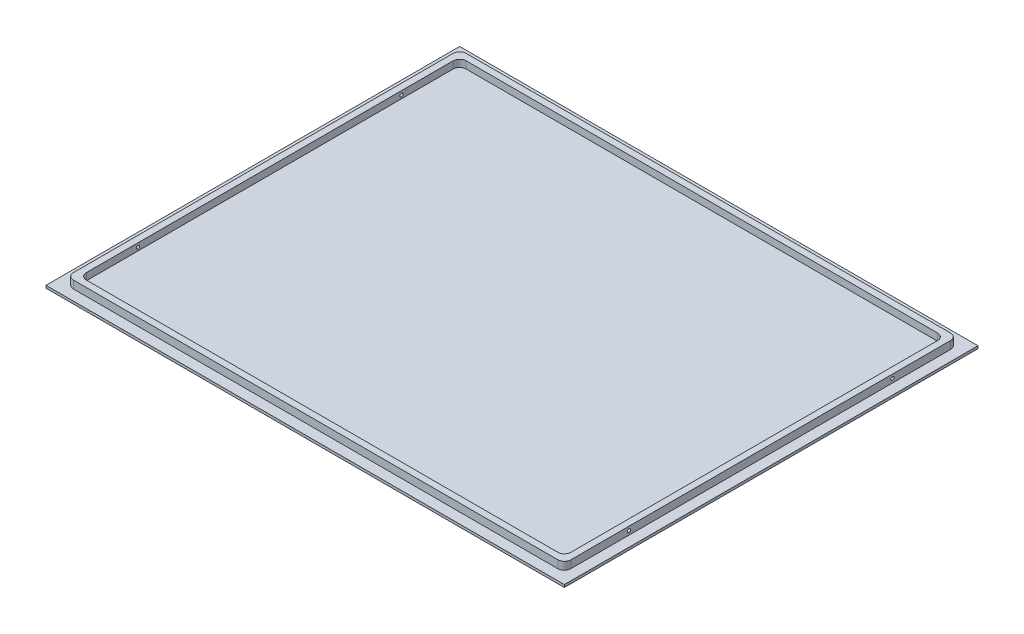
ISO-10303-21;
HEADER;
FILE_DESCRIPTION(('STEP AP214'),'2;1');
FILE_NAME('part.step','',(''),(''),'','','');
FILE_SCHEMA(('AUTOMOTIVE_DESIGN { 1 0 10303 214 1 1 1 1 }'));
ENDSEC;
DATA;
#1=APPLICATION_CONTEXT('core data for automotive mechanical design processes');
#2=APPLICATION_PROTOCOL_DEFINITION('international standard','automotive_design',2000,#1);
#3=PRODUCT_CONTEXT('',#1,'mechanical');
#4=PRODUCT('Part','Part','',(#3));
#5=PRODUCT_RELATED_PRODUCT_CATEGORY('part','',(#4));
#6=PRODUCT_DEFINITION_FORMATION('','',#4);
#7=PRODUCT_DEFINITION_CONTEXT('part definition',#1,'design');
#8=PRODUCT_DEFINITION('design','',#6,#7);
#9=PRODUCT_DEFINITION_SHAPE('','',#8);
#10=(LENGTH_UNIT() NAMED_UNIT(*) SI_UNIT(.MILLI.,.METRE.));
#11=(NAMED_UNIT(*) PLANE_ANGLE_UNIT() SI_UNIT($,.RADIAN.));
#12=(NAMED_UNIT(*) SI_UNIT($,.STERADIAN.) SOLID_ANGLE_UNIT());
#13=UNCERTAINTY_MEASURE_WITH_UNIT(LENGTH_MEASURE(1.E-05),#10,'distance_accuracy_value','');
#14=(GEOMETRIC_REPRESENTATION_CONTEXT(3) GLOBAL_UNCERTAINTY_ASSIGNED_CONTEXT((#13)) GLOBAL_UNIT_ASSIGNED_CONTEXT((#10,
#11,#12)) REPRESENTATION_CONTEXT('',''));
#15=CARTESIAN_POINT('',(0.,0.,0.));
#16=DIRECTION('',(0.,0.,1.));
#17=DIRECTION('',(1.,0.,0.));
#18=AXIS2_PLACEMENT_3D('',#15,#16,#17);
#19=CARTESIAN_POINT('',(-200.5,8.,-160.));
#20=DIRECTION('',(1.,0.,0.));
#21=DIRECTION('',(0.,0.,-1.));
#22=AXIS2_PLACEMENT_3D('',#19,#20,#21);
#23=PLANE('',#22);
#24=DIRECTION('',(0.,0.,1.));
#25=VECTOR('',#24,1.);
#26=CARTESIAN_POINT('',(-200.5,2.,-160.));
#27=LINE('',#26,#25);
#28=CARTESIAN_POINT('',(-200.5,2.,-160.));
#29=VERTEX_POINT('',#28);
#30=CARTESIAN_POINT('',(-200.5,2.,160.));
#31=VERTEX_POINT('',#30);
#32=EDGE_CURVE('E175',#29,#31,#27,.T.);
#33=ORIENTED_EDGE('',*,*,#32,.F.);
#34=DIRECTION('',(0.,-1.,0.));
#35=VECTOR('',#34,1.);
#36=CARTESIAN_POINT('',(-200.5,8.,-160.));
#37=LINE('',#36,#35);
#38=CARTESIAN_POINT('',(-200.5,0.,-160.));
#39=VERTEX_POINT('',#38);
#40=EDGE_CURVE('E187',#29,#39,#37,.T.);
#41=ORIENTED_EDGE('',*,*,#40,.T.);
#42=DIRECTION('',(0.,0.,1.));
#43=VECTOR('',#42,1.);
#44=CARTESIAN_POINT('',(-200.5,0.,-160.));
#45=LINE('',#44,#43);
#46=CARTESIAN_POINT('',(-200.5,0.,160.));
#47=VERTEX_POINT('',#46);
#48=EDGE_CURVE('E339',#39,#47,#45,.T.);
#49=ORIENTED_EDGE('',*,*,#48,.T.);
#50=DIRECTION('',(0.,-1.,0.));
#51=VECTOR('',#50,1.);
#52=CARTESIAN_POINT('',(-200.5,8.,160.));
#53=LINE('',#52,#51);
#54=EDGE_CURVE('E189',#31,#47,#53,.T.);
#55=ORIENTED_EDGE('',*,*,#54,.F.);
#56=EDGE_LOOP('',(#33,#41,#49,#55));
#57=FACE_BOUND('',#56,.T.);
#58=ADVANCED_FACE('F33',(#57),#23,.F.);
#59=CARTESIAN_POINT('',(-200.5,8.,160.));
#60=DIRECTION('',(0.,0.,-1.));
#61=DIRECTION('',(-1.,0.,0.));
#62=AXIS2_PLACEMENT_3D('',#59,#60,#61);
#63=PLANE('',#62);
#64=DIRECTION('',(1.,0.,0.));
#65=VECTOR('',#64,1.);
#66=CARTESIAN_POINT('',(-200.5,2.,160.));
#67=LINE('',#66,#65);
#68=CARTESIAN_POINT('',(200.5,2.,160.));
#69=VERTEX_POINT('',#68);
#70=EDGE_CURVE('E190',#31,#69,#67,.T.);
#71=ORIENTED_EDGE('',*,*,#70,.F.);
#72=ORIENTED_EDGE('',*,*,#54,.T.);
#73=DIRECTION('',(1.,0.,0.));
#74=VECTOR('',#73,1.);
#75=CARTESIAN_POINT('',(-200.5,0.,160.));
#76=LINE('',#75,#74);
#77=CARTESIAN_POINT('',(200.5,0.,160.));
#78=VERTEX_POINT('',#77);
#79=EDGE_CURVE('E341',#47,#78,#76,.T.);
#80=ORIENTED_EDGE('',*,*,#79,.T.);
#81=DIRECTION('',(0.,-1.,0.));
#82=VECTOR('',#81,1.);
#83=CARTESIAN_POINT('',(200.5,8.,160.));
#84=LINE('',#83,#82);
#85=EDGE_CURVE('E198',#69,#78,#84,.T.);
#86=ORIENTED_EDGE('',*,*,#85,.F.);
#87=EDGE_LOOP('',(#71,#72,#80,#86));
#88=FACE_BOUND('',#87,.T.);
#89=ADVANCED_FACE('F352',(#88),#63,.F.);
#90=CARTESIAN_POINT('',(200.5,8.,-160.));
#91=DIRECTION('',(-1.,0.,0.));
#92=DIRECTION('',(0.,0.,1.));
#93=AXIS2_PLACEMENT_3D('',#90,#91,#92);
#94=PLANE('',#93);
#95=DIRECTION('',(0.,0.,-1.));
#96=VECTOR('',#95,1.);
#97=CARTESIAN_POINT('',(200.5,2.,160.));
#98=LINE('',#97,#96);
#99=CARTESIAN_POINT('',(200.5,2.,-160.));
#100=VERTEX_POINT('',#99);
#101=EDGE_CURVE('E178',#69,#100,#98,.T.);
#102=ORIENTED_EDGE('',*,*,#101,.F.);
#103=ORIENTED_EDGE('',*,*,#85,.T.);
#104=DIRECTION('',(0.,0.,-1.));
#105=VECTOR('',#104,1.);
#106=CARTESIAN_POINT('',(200.5,0.,-160.));
#107=LINE('',#106,#105);
#108=CARTESIAN_POINT('',(200.5,0.,-160.));
#109=VERTEX_POINT('',#108);
#110=EDGE_CURVE('E200',#78,#109,#107,.T.);
#111=ORIENTED_EDGE('',*,*,#110,.T.);
#112=DIRECTION('',(0.,-1.,0.));
#113=VECTOR('',#112,1.);
#114=CARTESIAN_POINT('',(200.5,8.,-160.));
#115=LINE('',#114,#113);
#116=EDGE_CURVE('E196',#100,#109,#115,.T.);
#117=ORIENTED_EDGE('',*,*,#116,.F.);
#118=EDGE_LOOP('',(#102,#103,#111,#117));
#119=FACE_BOUND('',#118,.T.);
#120=ADVANCED_FACE('F346',(#119),#94,.F.);
#121=CARTESIAN_POINT('',(-200.5,8.,-160.));
#122=DIRECTION('',(0.,0.,1.));
#123=DIRECTION('',(1.,0.,0.));
#124=AXIS2_PLACEMENT_3D('',#121,#122,#123);
#125=PLANE('',#124);
#126=DIRECTION('',(-1.,0.,0.));
#127=VECTOR('',#126,1.);
#128=CARTESIAN_POINT('',(200.5,2.,-160.));
#129=LINE('',#128,#127);
#130=EDGE_CURVE('E172',#100,#29,#129,.T.);
#131=ORIENTED_EDGE('',*,*,#130,.F.);
#132=ORIENTED_EDGE('',*,*,#116,.T.);
#133=DIRECTION('',(-1.,0.,0.));
#134=VECTOR('',#133,1.);
#135=CARTESIAN_POINT('',(-200.5,0.,-160.));
#136=LINE('',#135,#134);
#137=EDGE_CURVE('E194',#109,#39,#136,.T.);
#138=ORIENTED_EDGE('',*,*,#137,.T.);
#139=ORIENTED_EDGE('',*,*,#40,.F.);
#140=EDGE_LOOP('',(#131,#132,#138,#139));
#141=FACE_BOUND('',#140,.T.);
#142=ADVANCED_FACE('F192',(#141),#125,.F.);
#143=CARTESIAN_POINT('',(-200.5,0.,160.));
#144=DIRECTION('',(0.,1.,0.));
#145=DIRECTION('',(0.,0.,1.));
#146=AXIS2_PLACEMENT_3D('',#143,#144,#145);
#147=PLANE('',#146);
#148=ORIENTED_EDGE('',*,*,#48,.F.);
#149=ORIENTED_EDGE('',*,*,#137,.F.);
#150=ORIENTED_EDGE('',*,*,#110,.F.);
#151=ORIENTED_EDGE('',*,*,#79,.F.);
#152=EDGE_LOOP('',(#148,#149,#150,#151));
#153=FACE_BOUND('',#152,.T.);
#154=ADVANCED_FACE('F350',(#153),#147,.F.);
#155=CARTESIAN_POINT('',(-200.5,2.,-160.));
#156=DIRECTION('',(0.,1.,0.));
#157=DIRECTION('',(0.,0.,1.));
#158=AXIS2_PLACEMENT_3D('',#155,#156,#157);
#159=PLANE('',#158);
#160=DIRECTION('',(1.,0.,0.));
#161=VECTOR('',#160,1.);
#162=CARTESIAN_POINT('',(-192.4,2.,151.9));
#163=LINE('',#162,#161);
#164=CARTESIAN_POINT('',(-187.4,2.,151.9));
#165=VERTEX_POINT('',#164);
#166=CARTESIAN_POINT('',(187.4,2.,151.9));
#167=VERTEX_POINT('',#166);
#168=EDGE_CURVE('E182',#165,#167,#163,.T.);
#169=ORIENTED_EDGE('',*,*,#168,.F.);
#170=CARTESIAN_POINT('',(-187.4,2.,146.9));
#171=DIRECTION('',(0.,1.,0.));
#172=DIRECTION('',(0.,0.,1.));
#173=AXIS2_PLACEMENT_3D('',#170,#171,#172);
#174=CIRCLE('',#173,5.);
#175=CARTESIAN_POINT('',(-192.4,2.,146.9));
#176=VERTEX_POINT('',#175);
#177=EDGE_CURVE('E266',#165,#176,#174,.F.);
#178=ORIENTED_EDGE('',*,*,#177,.T.);
#179=DIRECTION('',(0.,0.,1.));
#180=VECTOR('',#179,1.);
#181=CARTESIAN_POINT('',(-192.4,2.,-151.9));
#182=LINE('',#181,#180);
#183=CARTESIAN_POINT('',(-192.4,2.,-146.9));
#184=VERTEX_POINT('',#183);
#185=EDGE_CURVE('E322',#184,#176,#182,.T.);
#186=ORIENTED_EDGE('',*,*,#185,.F.);
#187=CARTESIAN_POINT('',(-187.4,2.,-146.9));
#188=DIRECTION('',(0.,1.,0.));
#189=DIRECTION('',(0.,0.,1.));
#190=AXIS2_PLACEMENT_3D('',#187,#188,#189);
#191=CIRCLE('',#190,5.);
#192=CARTESIAN_POINT('',(-187.4,2.,-151.9));
#193=VERTEX_POINT('',#192);
#194=EDGE_CURVE('E264',#184,#193,#191,.F.);
#195=ORIENTED_EDGE('',*,*,#194,.T.);
#196=DIRECTION('',(-1.,0.,0.));
#197=VECTOR('',#196,1.);
#198=CARTESIAN_POINT('',(-192.4,2.,-151.9));
#199=LINE('',#198,#197);
#200=CARTESIAN_POINT('',(187.4,2.,-151.9));
#201=VERTEX_POINT('',#200);
#202=EDGE_CURVE('E318',#201,#193,#199,.T.);
#203=ORIENTED_EDGE('',*,*,#202,.F.);
#204=CARTESIAN_POINT('',(187.4,2.,-146.9));
#205=DIRECTION('',(0.,1.,0.));
#206=DIRECTION('',(0.,0.,1.));
#207=AXIS2_PLACEMENT_3D('',#204,#205,#206);
#208=CIRCLE('',#207,5.);
#209=CARTESIAN_POINT('',(192.4,2.,-146.9));
#210=VERTEX_POINT('',#209);
#211=EDGE_CURVE('E262',#201,#210,#208,.F.);
#212=ORIENTED_EDGE('',*,*,#211,.T.);
#213=DIRECTION('',(0.,0.,-1.));
#214=VECTOR('',#213,1.);
#215=CARTESIAN_POINT('',(192.4,2.,-151.9));
#216=LINE('',#215,#214);
#217=CARTESIAN_POINT('',(192.4,2.,146.9));
#218=VERTEX_POINT('',#217);
#219=EDGE_CURVE('E315',#218,#210,#216,.T.);
#220=ORIENTED_EDGE('',*,*,#219,.F.);
#221=CARTESIAN_POINT('',(187.4,2.,146.9));
#222=DIRECTION('',(0.,1.,0.));
#223=DIRECTION('',(0.,0.,1.));
#224=AXIS2_PLACEMENT_3D('',#221,#222,#223);
#225=CIRCLE('',#224,5.);
#226=EDGE_CURVE('E260',#218,#167,#225,.F.);
#227=ORIENTED_EDGE('',*,*,#226,.T.);
#228=EDGE_LOOP('',(#169,#178,#186,#195,#203,#212,#220,#227));
#229=FACE_BOUND('',#228,.T.);
#230=ORIENTED_EDGE('',*,*,#130,.T.);
#231=ORIENTED_EDGE('',*,*,#32,.T.);
#232=ORIENTED_EDGE('',*,*,#70,.T.);
#233=ORIENTED_EDGE('',*,*,#101,.T.);
#234=EDGE_LOOP('',(#230,#231,#232,#233));
#235=FACE_BOUND('',#234,.T.);
#236=ADVANCED_FACE('F174',(#229,#235),#159,.T.);
#237=CARTESIAN_POINT('',(192.4,2.,-151.9));
#238=DIRECTION('',(1.,0.,0.));
#239=DIRECTION('',(0.,0.,-1.));
#240=AXIS2_PLACEMENT_3D('',#237,#238,#239);
#241=PLANE('',#240);
#242=CARTESIAN_POINT('',(192.4,5.00000000000002,101.9));
#243=DIRECTION('',(1.,0.,0.));
#244=DIRECTION('',(0.,0.,-1.));
#245=AXIS2_PLACEMENT_3D('',#242,#243,#244);
#246=CIRCLE('',#245,1.24999999999998);
#247=CARTESIAN_POINT('',(192.4,5.00000000000002,100.65));
#248=VERTEX_POINT('',#247);
#249=EDGE_CURVE('E282',#248,#248,#246,.T.);
#250=ORIENTED_EDGE('',*,*,#249,.F.);
#251=EDGE_LOOP('',(#250));
#252=FACE_BOUND('',#251,.T.);
#253=CARTESIAN_POINT('',(192.4,5.,-101.9));
#254=DIRECTION('',(1.,0.,0.));
#255=DIRECTION('',(0.,0.,-1.));
#256=AXIS2_PLACEMENT_3D('',#253,#254,#255);
#257=CIRCLE('',#256,1.25);
#258=CARTESIAN_POINT('',(192.4,5.,-103.15));
#259=VERTEX_POINT('',#258);
#260=EDGE_CURVE('E279',#259,#259,#257,.T.);
#261=ORIENTED_EDGE('',*,*,#260,.F.);
#262=EDGE_LOOP('',(#261));
#263=FACE_BOUND('',#262,.T.);
#264=DIRECTION('',(0.,0.,-1.));
#265=VECTOR('',#264,1.);
#266=CARTESIAN_POINT('',(192.4,8.,-151.9));
#267=LINE('',#266,#265);
#268=CARTESIAN_POINT('',(192.4,8.,146.9));
#269=VERTEX_POINT('',#268);
#270=CARTESIAN_POINT('',(192.4,8.,-146.9));
#271=VERTEX_POINT('',#270);
#272=EDGE_CURVE('E305',#269,#271,#267,.T.);
#273=ORIENTED_EDGE('',*,*,#272,.F.);
#274=DIRECTION('',(0.,1.,0.));
#275=VECTOR('',#274,1.);
#276=CARTESIAN_POINT('',(192.4,2.,146.9));
#277=LINE('',#276,#275);
#278=EDGE_CURVE('E222',#269,#218,#277,.F.);
#279=ORIENTED_EDGE('',*,*,#278,.T.);
#280=ORIENTED_EDGE('',*,*,#219,.T.);
#281=DIRECTION('',(0.,1.,0.));
#282=VECTOR('',#281,1.);
#283=CARTESIAN_POINT('',(192.4,2.,-146.9));
#284=LINE('',#283,#282);
#285=EDGE_CURVE('E219',#210,#271,#284,.T.);
#286=ORIENTED_EDGE('',*,*,#285,.T.);
#287=EDGE_LOOP('',(#273,#279,#280,#286));
#288=FACE_BOUND('',#287,.T.);
#289=ADVANCED_FACE('F451',(#252,#263,#288),#241,.T.);
#290=CARTESIAN_POINT('',(-192.4,2.,151.9));
#291=DIRECTION('',(0.,0.,1.));
#292=DIRECTION('',(1.,0.,0.));
#293=AXIS2_PLACEMENT_3D('',#290,#291,#292);
#294=PLANE('',#293);
#295=ORIENTED_EDGE('',*,*,#168,.T.);
#296=DIRECTION('',(0.,1.,0.));
#297=VECTOR('',#296,1.);
#298=CARTESIAN_POINT('',(187.4,2.,151.9));
#299=LINE('',#298,#297);
#300=CARTESIAN_POINT('',(187.4,8.,151.9));
#301=VERTEX_POINT('',#300);
#302=EDGE_CURVE('E208',#167,#301,#299,.T.);
#303=ORIENTED_EDGE('',*,*,#302,.T.);
#304=DIRECTION('',(1.,0.,0.));
#305=VECTOR('',#304,1.);
#306=CARTESIAN_POINT('',(-192.4,8.,151.9));
#307=LINE('',#306,#305);
#308=CARTESIAN_POINT('',(-187.4,8.,151.9));
#309=VERTEX_POINT('',#308);
#310=EDGE_CURVE('E319',#309,#301,#307,.T.);
#311=ORIENTED_EDGE('',*,*,#310,.F.);
#312=DIRECTION('',(0.,1.,0.));
#313=VECTOR('',#312,1.);
#314=CARTESIAN_POINT('',(-187.4,2.,151.9));
#315=LINE('',#314,#313);
#316=EDGE_CURVE('E206',#309,#165,#315,.F.);
#317=ORIENTED_EDGE('',*,*,#316,.T.);
#318=EDGE_LOOP('',(#295,#303,#311,#317));
#319=FACE_BOUND('',#318,.T.);
#320=ADVANCED_FACE('F429',(#319),#294,.T.);
#321=CARTESIAN_POINT('',(-192.4,2.,-151.9));
#322=DIRECTION('',(-1.,0.,0.));
#323=DIRECTION('',(0.,0.,1.));
#324=AXIS2_PLACEMENT_3D('',#321,#322,#323);
#325=PLANE('',#324);
#326=CARTESIAN_POINT('',(-192.4,5.00000000000002,101.9));
#327=DIRECTION('',(-1.,0.,0.));
#328=DIRECTION('',(0.,0.,-1.));
#329=AXIS2_PLACEMENT_3D('',#326,#327,#328);
#330=CIRCLE('',#329,1.24999999999998);
#331=CARTESIAN_POINT('',(-192.4,5.00000000000002,100.65));
#332=VERTEX_POINT('',#331);
#333=EDGE_CURVE('E645',#332,#332,#330,.T.);
#334=ORIENTED_EDGE('',*,*,#333,.F.);
#335=EDGE_LOOP('',(#334));
#336=FACE_BOUND('',#335,.T.);
#337=CARTESIAN_POINT('',(-192.4,5.,-101.9));
#338=DIRECTION('',(-1.,0.,0.));
#339=DIRECTION('',(0.,0.,1.));
#340=AXIS2_PLACEMENT_3D('',#337,#338,#339);
#341=CIRCLE('',#340,1.25);
#342=CARTESIAN_POINT('',(-192.4,5.,-100.65));
#343=VERTEX_POINT('',#342);
#344=EDGE_CURVE('E275',#343,#343,#341,.T.);
#345=ORIENTED_EDGE('',*,*,#344,.F.);
#346=EDGE_LOOP('',(#345));
#347=FACE_BOUND('',#346,.T.);
#348=DIRECTION('',(0.,0.,1.));
#349=VECTOR('',#348,1.);
#350=CARTESIAN_POINT('',(-192.4,8.,-151.9));
#351=LINE('',#350,#349);
#352=CARTESIAN_POINT('',(-192.4,8.,-146.9));
#353=VERTEX_POINT('',#352);
#354=CARTESIAN_POINT('',(-192.4,8.,146.9));
#355=VERTEX_POINT('',#354);
#356=EDGE_CURVE('E332',#353,#355,#351,.T.);
#357=ORIENTED_EDGE('',*,*,#356,.F.);
#358=DIRECTION('',(0.,1.,0.));
#359=VECTOR('',#358,1.);
#360=CARTESIAN_POINT('',(-192.4,2.,-146.9));
#361=LINE('',#360,#359);
#362=EDGE_CURVE('E232',#353,#184,#361,.F.);
#363=ORIENTED_EDGE('',*,*,#362,.T.);
#364=ORIENTED_EDGE('',*,*,#185,.T.);
#365=DIRECTION('',(0.,1.,0.));
#366=VECTOR('',#365,1.);
#367=CARTESIAN_POINT('',(-192.4,2.,146.9));
#368=LINE('',#367,#366);
#369=EDGE_CURVE('E229',#176,#355,#368,.T.);
#370=ORIENTED_EDGE('',*,*,#369,.T.);
#371=EDGE_LOOP('',(#357,#363,#364,#370));
#372=FACE_BOUND('',#371,.T.);
#373=ADVANCED_FACE('F439',(#336,#347,#372),#325,.T.);
#374=CARTESIAN_POINT('',(-192.4,2.,-151.9));
#375=DIRECTION('',(0.,0.,-1.));
#376=DIRECTION('',(-1.,0.,0.));
#377=AXIS2_PLACEMENT_3D('',#374,#375,#376);
#378=PLANE('',#377);
#379=DIRECTION('',(-1.,0.,0.));
#380=VECTOR('',#379,1.);
#381=CARTESIAN_POINT('',(-192.4,8.,-151.9));
#382=LINE('',#381,#380);
#383=CARTESIAN_POINT('',(187.4,8.,-151.9));
#384=VERTEX_POINT('',#383);
#385=CARTESIAN_POINT('',(-187.4,8.,-151.9));
#386=VERTEX_POINT('',#385);
#387=EDGE_CURVE('E329',#384,#386,#382,.T.);
#388=ORIENTED_EDGE('',*,*,#387,.F.);
#389=DIRECTION('',(0.,1.,0.));
#390=VECTOR('',#389,1.);
#391=CARTESIAN_POINT('',(187.4,2.,-151.9));
#392=LINE('',#391,#390);
#393=EDGE_CURVE('E227',#384,#201,#392,.F.);
#394=ORIENTED_EDGE('',*,*,#393,.T.);
#395=ORIENTED_EDGE('',*,*,#202,.T.);
#396=DIRECTION('',(0.,1.,0.));
#397=VECTOR('',#396,1.);
#398=CARTESIAN_POINT('',(-187.4,2.,-151.9));
#399=LINE('',#398,#397);
#400=EDGE_CURVE('E224',#193,#386,#399,.T.);
#401=ORIENTED_EDGE('',*,*,#400,.T.);
#402=EDGE_LOOP('',(#388,#394,#395,#401));
#403=FACE_BOUND('',#402,.T.);
#404=ADVANCED_FACE('F423',(#403),#378,.T.);
#405=CARTESIAN_POINT('',(-200.5,8.,160.));
#406=DIRECTION('',(0.,1.,0.));
#407=DIRECTION('',(0.,0.,1.));
#408=AXIS2_PLACEMENT_3D('',#405,#406,#407);
#409=PLANE('',#408);
#410=DIRECTION('',(0.,0.,1.));
#411=VECTOR('',#410,1.);
#412=CARTESIAN_POINT('',(-187.4,8.,146.9));
#413=LINE('',#412,#411);
#414=CARTESIAN_POINT('',(-187.4,8.,-141.9));
#415=VERTEX_POINT('',#414);
#416=CARTESIAN_POINT('',(-187.4,8.,141.9));
#417=VERTEX_POINT('',#416);
#418=EDGE_CURVE('E293',#415,#417,#413,.T.);
#419=ORIENTED_EDGE('',*,*,#418,.F.);
#420=CARTESIAN_POINT('',(-182.4,8.,-141.9));
#421=DIRECTION('',(0.,1.,0.));
#422=DIRECTION('',(0.,0.,1.));
#423=AXIS2_PLACEMENT_3D('',#420,#421,#422);
#424=CIRCLE('',#423,5.);
#425=CARTESIAN_POINT('',(-182.4,8.,-146.9));
#426=VERTEX_POINT('',#425);
#427=EDGE_CURVE('E42',#415,#426,#424,.F.);
#428=ORIENTED_EDGE('',*,*,#427,.T.);
#429=DIRECTION('',(-1.,0.,0.));
#430=VECTOR('',#429,1.);
#431=CARTESIAN_POINT('',(187.4,8.,-146.9));
#432=LINE('',#431,#430);
#433=CARTESIAN_POINT('',(182.4,8.,-146.9));
#434=VERTEX_POINT('',#433);
#435=EDGE_CURVE('E298',#434,#426,#432,.T.);
#436=ORIENTED_EDGE('',*,*,#435,.F.);
#437=CARTESIAN_POINT('',(182.4,8.,-141.9));
#438=DIRECTION('',(0.,1.,0.));
#439=DIRECTION('',(0.,0.,1.));
#440=AXIS2_PLACEMENT_3D('',#437,#438,#439);
#441=CIRCLE('',#440,5.);
#442=CARTESIAN_POINT('',(187.4,8.,-141.9));
#443=VERTEX_POINT('',#442);
#444=EDGE_CURVE('E12',#434,#443,#441,.F.);
#445=ORIENTED_EDGE('',*,*,#444,.T.);
#446=DIRECTION('',(0.,0.,-1.));
#447=VECTOR('',#446,1.);
#448=CARTESIAN_POINT('',(187.4,8.,146.9));
#449=LINE('',#448,#447);
#450=CARTESIAN_POINT('',(187.4,8.,141.9));
#451=VERTEX_POINT('',#450);
#452=EDGE_CURVE('E311',#451,#443,#449,.T.);
#453=ORIENTED_EDGE('',*,*,#452,.F.);
#454=CARTESIAN_POINT('',(182.4,8.,141.9));
#455=DIRECTION('',(0.,1.,0.));
#456=DIRECTION('',(0.,0.,1.));
#457=AXIS2_PLACEMENT_3D('',#454,#455,#456);
#458=CIRCLE('',#457,5.);
#459=CARTESIAN_POINT('',(182.4,8.,146.9));
#460=VERTEX_POINT('',#459);
#461=EDGE_CURVE('E268',#451,#460,#458,.F.);
#462=ORIENTED_EDGE('',*,*,#461,.T.);
#463=DIRECTION('',(1.,0.,0.));
#464=VECTOR('',#463,1.);
#465=CARTESIAN_POINT('',(187.4,8.,146.9));
#466=LINE('',#465,#464);
#467=CARTESIAN_POINT('',(-182.4,8.,146.9));
#468=VERTEX_POINT('',#467);
#469=EDGE_CURVE('E308',#468,#460,#466,.T.);
#470=ORIENTED_EDGE('',*,*,#469,.F.);
#471=CARTESIAN_POINT('',(-182.4,8.,141.9));
#472=DIRECTION('',(0.,1.,0.));
#473=DIRECTION('',(0.,0.,1.));
#474=AXIS2_PLACEMENT_3D('',#471,#472,#473);
#475=CIRCLE('',#474,5.);
#476=EDGE_CURVE('E270',#468,#417,#475,.F.);
#477=ORIENTED_EDGE('',*,*,#476,.T.);
#478=EDGE_LOOP('',(#419,#428,#436,#445,#453,#462,#470,#477));
#479=FACE_BOUND('',#478,.T.);
#480=ORIENTED_EDGE('',*,*,#310,.T.);
#481=CARTESIAN_POINT('',(187.4,8.,146.9));
#482=DIRECTION('',(0.,1.,0.));
#483=DIRECTION('',(0.,0.,1.));
#484=AXIS2_PLACEMENT_3D('',#481,#482,#483);
#485=CIRCLE('',#484,5.);
#486=EDGE_CURVE('E217',#301,#269,#485,.T.);
#487=ORIENTED_EDGE('',*,*,#486,.T.);
#488=ORIENTED_EDGE('',*,*,#272,.T.);
#489=CARTESIAN_POINT('',(187.4,8.,-146.9));
#490=DIRECTION('',(0.,1.,0.));
#491=DIRECTION('',(0.,0.,1.));
#492=AXIS2_PLACEMENT_3D('',#489,#490,#491);
#493=CIRCLE('',#492,5.);
#494=EDGE_CURVE('E215',#271,#384,#493,.T.);
#495=ORIENTED_EDGE('',*,*,#494,.T.);
#496=ORIENTED_EDGE('',*,*,#387,.T.);
#497=CARTESIAN_POINT('',(-187.4,8.,-146.9));
#498=DIRECTION('',(0.,1.,0.));
#499=DIRECTION('',(0.,0.,1.));
#500=AXIS2_PLACEMENT_3D('',#497,#498,#499);
#501=CIRCLE('',#500,5.);
#502=EDGE_CURVE('E213',#386,#353,#501,.T.);
#503=ORIENTED_EDGE('',*,*,#502,.T.);
#504=ORIENTED_EDGE('',*,*,#356,.T.);
#505=CARTESIAN_POINT('',(-187.4,8.,146.9));
#506=DIRECTION('',(0.,1.,0.));
#507=DIRECTION('',(0.,0.,1.));
#508=AXIS2_PLACEMENT_3D('',#505,#506,#507);
#509=CIRCLE('',#508,5.);
#510=EDGE_CURVE('E211',#355,#309,#509,.T.);
#511=ORIENTED_EDGE('',*,*,#510,.T.);
#512=EDGE_LOOP('',(#480,#487,#488,#495,#496,#503,#504,#511));
#513=FACE_BOUND('',#512,.T.);
#514=ADVANCED_FACE('F420',(#479,#513),#409,.T.);
#515=CARTESIAN_POINT('',(-187.4,2.5,146.9));
#516=DIRECTION('',(-1.,0.,0.));
#517=DIRECTION('',(0.,0.,1.));
#518=AXIS2_PLACEMENT_3D('',#515,#516,#517);
#519=PLANE('',#518);
#520=CARTESIAN_POINT('',(-187.4,5.00000000000002,101.9));
#521=DIRECTION('',(-1.,0.,0.));
#522=DIRECTION('',(0.,0.,1.));
#523=AXIS2_PLACEMENT_3D('',#520,#521,#522);
#524=CIRCLE('',#523,1.24999999999998);
#525=CARTESIAN_POINT('',(-187.4,5.00000000000002,103.15));
#526=VERTEX_POINT('',#525);
#527=EDGE_CURVE('E287',#526,#526,#524,.T.);
#528=ORIENTED_EDGE('',*,*,#527,.T.);
#529=EDGE_LOOP('',(#528));
#530=FACE_BOUND('',#529,.T.);
#531=CARTESIAN_POINT('',(-187.4,5.,-101.9));
#532=DIRECTION('',(-1.,0.,0.));
#533=DIRECTION('',(0.,0.,1.));
#534=AXIS2_PLACEMENT_3D('',#531,#532,#533);
#535=CIRCLE('',#534,1.25);
#536=CARTESIAN_POINT('',(-187.4,5.,-100.65));
#537=VERTEX_POINT('',#536);
#538=EDGE_CURVE('E274',#537,#537,#535,.T.);
#539=ORIENTED_EDGE('',*,*,#538,.T.);
#540=EDGE_LOOP('',(#539));
#541=FACE_BOUND('',#540,.T.);
#542=ORIENTED_EDGE('',*,*,#418,.T.);
#543=DIRECTION('',(0.,1.,0.));
#544=VECTOR('',#543,1.);
#545=CARTESIAN_POINT('',(-187.4,2.5,141.9));
#546=LINE('',#545,#544);
#547=CARTESIAN_POINT('',(-187.4,2.5,141.9));
#548=VERTEX_POINT('',#547);
#549=EDGE_CURVE('E254',#417,#548,#546,.F.);
#550=ORIENTED_EDGE('',*,*,#549,.T.);
#551=DIRECTION('',(0.,0.,1.));
#552=VECTOR('',#551,1.);
#553=CARTESIAN_POINT('',(-187.4,2.5,146.9));
#554=LINE('',#553,#552);
#555=CARTESIAN_POINT('',(-187.4,2.5,-141.9));
#556=VERTEX_POINT('',#555);
#557=EDGE_CURVE('E294',#556,#548,#554,.T.);
#558=ORIENTED_EDGE('',*,*,#557,.F.);
#559=DIRECTION('',(0.,1.,0.));
#560=VECTOR('',#559,1.);
#561=CARTESIAN_POINT('',(-187.4,8.,-141.9));
#562=LINE('',#561,#560);
#563=EDGE_CURVE('E251',#556,#415,#562,.T.);
#564=ORIENTED_EDGE('',*,*,#563,.T.);
#565=EDGE_LOOP('',(#542,#550,#558,#564));
#566=FACE_BOUND('',#565,.T.);
#567=ADVANCED_FACE('F400',(#530,#541,#566),#519,.F.);
#568=CARTESIAN_POINT('',(187.4,2.5,-146.9));
#569=DIRECTION('',(0.,0.,-1.));
#570=DIRECTION('',(-1.,0.,0.));
#571=AXIS2_PLACEMENT_3D('',#568,#569,#570);
#572=PLANE('',#571);
#573=ORIENTED_EDGE('',*,*,#435,.T.);
#574=DIRECTION('',(0.,1.,0.));
#575=VECTOR('',#574,1.);
#576=CARTESIAN_POINT('',(-182.4,2.5,-146.9));
#577=LINE('',#576,#575);
#578=CARTESIAN_POINT('',(-182.4,2.5,-146.9));
#579=VERTEX_POINT('',#578);
#580=EDGE_CURVE('E50',#426,#579,#577,.F.);
#581=ORIENTED_EDGE('',*,*,#580,.T.);
#582=DIRECTION('',(-1.,0.,0.));
#583=VECTOR('',#582,1.);
#584=CARTESIAN_POINT('',(187.4,2.5,-146.9));
#585=LINE('',#584,#583);
#586=CARTESIAN_POINT('',(182.4,2.5,-146.9));
#587=VERTEX_POINT('',#586);
#588=EDGE_CURVE('E303',#587,#579,#585,.T.);
#589=ORIENTED_EDGE('',*,*,#588,.F.);
#590=DIRECTION('',(0.,1.,0.));
#591=VECTOR('',#590,1.);
#592=CARTESIAN_POINT('',(182.4,8.,-146.9));
#593=LINE('',#592,#591);
#594=EDGE_CURVE('E256',#587,#434,#593,.T.);
#595=ORIENTED_EDGE('',*,*,#594,.T.);
#596=EDGE_LOOP('',(#573,#581,#589,#595));
#597=FACE_BOUND('',#596,.T.);
#598=ADVANCED_FACE('F418',(#597),#572,.F.);
#599=CARTESIAN_POINT('',(187.4,2.5,146.9));
#600=DIRECTION('',(1.,0.,0.));
#601=DIRECTION('',(0.,0.,-1.));
#602=AXIS2_PLACEMENT_3D('',#599,#600,#601);
#603=PLANE('',#602);
#604=CARTESIAN_POINT('',(187.4,5.00000000000002,101.9));
#605=DIRECTION('',(1.,0.,0.));
#606=DIRECTION('',(0.,0.,-1.));
#607=AXIS2_PLACEMENT_3D('',#604,#605,#606);
#608=CIRCLE('',#607,1.24999999999998);
#609=CARTESIAN_POINT('',(187.4,5.00000000000002,100.65));
#610=VERTEX_POINT('',#609);
#611=EDGE_CURVE('E37',#610,#610,#608,.T.);
#612=ORIENTED_EDGE('',*,*,#611,.T.);
#613=EDGE_LOOP('',(#612));
#614=FACE_BOUND('',#613,.T.);
#615=CARTESIAN_POINT('',(187.4,5.,-101.9));
#616=DIRECTION('',(1.,0.,0.));
#617=DIRECTION('',(0.,0.,-1.));
#618=AXIS2_PLACEMENT_3D('',#615,#616,#617);
#619=CIRCLE('',#618,1.25);
#620=CARTESIAN_POINT('',(187.4,5.,-103.15));
#621=VERTEX_POINT('',#620);
#622=EDGE_CURVE('E272',#621,#621,#619,.T.);
#623=ORIENTED_EDGE('',*,*,#622,.T.);
#624=EDGE_LOOP('',(#623));
#625=FACE_BOUND('',#624,.T.);
#626=DIRECTION('',(0.,0.,-1.));
#627=VECTOR('',#626,1.);
#628=CARTESIAN_POINT('',(187.4,2.5,146.9));
#629=LINE('',#628,#627);
#630=CARTESIAN_POINT('',(187.4,2.5,141.9));
#631=VERTEX_POINT('',#630);
#632=CARTESIAN_POINT('',(187.4,2.5,-141.9));
#633=VERTEX_POINT('',#632);
#634=EDGE_CURVE('E301',#631,#633,#629,.T.);
#635=ORIENTED_EDGE('',*,*,#634,.F.);
#636=DIRECTION('',(0.,1.,0.));
#637=VECTOR('',#636,1.);
#638=CARTESIAN_POINT('',(187.4,8.,141.9));
#639=LINE('',#638,#637);
#640=EDGE_CURVE('E236',#631,#451,#639,.T.);
#641=ORIENTED_EDGE('',*,*,#640,.T.);
#642=ORIENTED_EDGE('',*,*,#452,.T.);
#643=DIRECTION('',(0.,1.,0.));
#644=VECTOR('',#643,1.);
#645=CARTESIAN_POINT('',(187.4,2.5,-141.9));
#646=LINE('',#645,#644);
#647=EDGE_CURVE('E234',#443,#633,#646,.F.);
#648=ORIENTED_EDGE('',*,*,#647,.T.);
#649=EDGE_LOOP('',(#635,#641,#642,#648));
#650=FACE_BOUND('',#649,.T.);
#651=ADVANCED_FACE('F413',(#614,#625,#650),#603,.F.);
#652=CARTESIAN_POINT('',(187.4,2.5,146.9));
#653=DIRECTION('',(0.,0.,1.));
#654=DIRECTION('',(1.,0.,0.));
#655=AXIS2_PLACEMENT_3D('',#652,#653,#654);
#656=PLANE('',#655);
#657=ORIENTED_EDGE('',*,*,#469,.T.);
#658=DIRECTION('',(0.,1.,0.));
#659=VECTOR('',#658,1.);
#660=CARTESIAN_POINT('',(182.4,2.5,146.9));
#661=LINE('',#660,#659);
#662=CARTESIAN_POINT('',(182.4,2.5,146.9));
#663=VERTEX_POINT('',#662);
#664=EDGE_CURVE('E242',#460,#663,#661,.F.);
#665=ORIENTED_EDGE('',*,*,#664,.T.);
#666=DIRECTION('',(1.,0.,0.));
#667=VECTOR('',#666,1.);
#668=CARTESIAN_POINT('',(187.4,2.5,146.9));
#669=LINE('',#668,#667);
#670=CARTESIAN_POINT('',(-182.4,2.5,146.9));
#671=VERTEX_POINT('',#670);
#672=EDGE_CURVE('E297',#671,#663,#669,.T.);
#673=ORIENTED_EDGE('',*,*,#672,.F.);
#674=DIRECTION('',(0.,1.,0.));
#675=VECTOR('',#674,1.);
#676=CARTESIAN_POINT('',(-182.4,8.,146.9));
#677=LINE('',#676,#675);
#678=EDGE_CURVE('E239',#671,#468,#677,.T.);
#679=ORIENTED_EDGE('',*,*,#678,.T.);
#680=EDGE_LOOP('',(#657,#665,#673,#679));
#681=FACE_BOUND('',#680,.T.);
#682=ADVANCED_FACE('F407',(#681),#656,.F.);
#683=CARTESIAN_POINT('',(-187.4,2.5,-146.9));
#684=DIRECTION('',(0.,1.,0.));
#685=DIRECTION('',(0.,0.,1.));
#686=AXIS2_PLACEMENT_3D('',#683,#684,#685);
#687=PLANE('',#686);
#688=ORIENTED_EDGE('',*,*,#672,.T.);
#689=CARTESIAN_POINT('',(182.4,2.5,141.9));
#690=DIRECTION('',(0.,1.,0.));
#691=DIRECTION('',(0.,0.,1.));
#692=AXIS2_PLACEMENT_3D('',#689,#690,#691);
#693=CIRCLE('',#692,5.);
#694=EDGE_CURVE('E249',#663,#631,#693,.T.);
#695=ORIENTED_EDGE('',*,*,#694,.T.);
#696=ORIENTED_EDGE('',*,*,#634,.T.);
#697=CARTESIAN_POINT('',(182.4,2.5,-141.9));
#698=DIRECTION('',(0.,1.,0.));
#699=DIRECTION('',(0.,0.,1.));
#700=AXIS2_PLACEMENT_3D('',#697,#698,#699);
#701=CIRCLE('',#700,5.);
#702=EDGE_CURVE('E57',#633,#587,#701,.T.);
#703=ORIENTED_EDGE('',*,*,#702,.T.);
#704=ORIENTED_EDGE('',*,*,#588,.T.);
#705=CARTESIAN_POINT('',(-182.4,2.5,-141.9));
#706=DIRECTION('',(0.,1.,0.));
#707=DIRECTION('',(0.,0.,1.));
#708=AXIS2_PLACEMENT_3D('',#705,#706,#707);
#709=CIRCLE('',#708,5.);
#710=EDGE_CURVE('E245',#579,#556,#709,.T.);
#711=ORIENTED_EDGE('',*,*,#710,.T.);
#712=ORIENTED_EDGE('',*,*,#557,.T.);
#713=CARTESIAN_POINT('',(-182.4,2.5,141.9));
#714=DIRECTION('',(0.,1.,0.));
#715=DIRECTION('',(0.,0.,1.));
#716=AXIS2_PLACEMENT_3D('',#713,#714,#715);
#717=CIRCLE('',#716,5.);
#718=EDGE_CURVE('E247',#548,#671,#717,.T.);
#719=ORIENTED_EDGE('',*,*,#718,.T.);
#720=EDGE_LOOP('',(#688,#695,#696,#703,#704,#711,#712,#719));
#721=FACE_BOUND('',#720,.T.);
#722=ADVANCED_FACE('F367',(#721),#687,.T.);
#723=CARTESIAN_POINT('',(187.4,2.,146.9));
#724=DIRECTION('',(0.,1.,0.));
#725=DIRECTION('',(0.,0.,1.));
#726=AXIS2_PLACEMENT_3D('',#723,#724,#725);
#727=CYLINDRICAL_SURFACE('',#726,5.);
#728=ORIENTED_EDGE('',*,*,#226,.F.);
#729=ORIENTED_EDGE('',*,*,#278,.F.);
#730=ORIENTED_EDGE('',*,*,#486,.F.);
#731=ORIENTED_EDGE('',*,*,#302,.F.);
#732=EDGE_LOOP('',(#728,#729,#730,#731));
#733=FACE_BOUND('',#732,.T.);
#734=ADVANCED_FACE('F363',(#733),#727,.T.);
#735=CARTESIAN_POINT('',(187.4,2.,-146.9));
#736=DIRECTION('',(0.,1.,0.));
#737=DIRECTION('',(0.,0.,1.));
#738=AXIS2_PLACEMENT_3D('',#735,#736,#737);
#739=CYLINDRICAL_SURFACE('',#738,5.);
#740=ORIENTED_EDGE('',*,*,#211,.F.);
#741=ORIENTED_EDGE('',*,*,#393,.F.);
#742=ORIENTED_EDGE('',*,*,#494,.F.);
#743=ORIENTED_EDGE('',*,*,#285,.F.);
#744=EDGE_LOOP('',(#740,#741,#742,#743));
#745=FACE_BOUND('',#744,.T.);
#746=ADVANCED_FACE('F366',(#745),#739,.T.);
#747=CARTESIAN_POINT('',(-187.4,2.,-146.9));
#748=DIRECTION('',(0.,1.,0.));
#749=DIRECTION('',(0.,0.,1.));
#750=AXIS2_PLACEMENT_3D('',#747,#748,#749);
#751=CYLINDRICAL_SURFACE('',#750,5.);
#752=ORIENTED_EDGE('',*,*,#194,.F.);
#753=ORIENTED_EDGE('',*,*,#362,.F.);
#754=ORIENTED_EDGE('',*,*,#502,.F.);
#755=ORIENTED_EDGE('',*,*,#400,.F.);
#756=EDGE_LOOP('',(#752,#753,#754,#755));
#757=FACE_BOUND('',#756,.T.);
#758=ADVANCED_FACE('F371',(#757),#751,.T.);
#759=CARTESIAN_POINT('',(-187.4,2.,146.9));
#760=DIRECTION('',(0.,1.,0.));
#761=DIRECTION('',(0.,0.,1.));
#762=AXIS2_PLACEMENT_3D('',#759,#760,#761);
#763=CYLINDRICAL_SURFACE('',#762,5.);
#764=ORIENTED_EDGE('',*,*,#177,.F.);
#765=ORIENTED_EDGE('',*,*,#316,.F.);
#766=ORIENTED_EDGE('',*,*,#510,.F.);
#767=ORIENTED_EDGE('',*,*,#369,.F.);
#768=EDGE_LOOP('',(#764,#765,#766,#767));
#769=FACE_BOUND('',#768,.T.);
#770=ADVANCED_FACE('F375',(#769),#763,.T.);
#771=CARTESIAN_POINT('',(182.4,2.5,141.9));
#772=DIRECTION('',(0.,-1.,0.));
#773=DIRECTION('',(0.,0.,-1.));
#774=AXIS2_PLACEMENT_3D('',#771,#772,#773);
#775=CYLINDRICAL_SURFACE('',#774,5.);
#776=ORIENTED_EDGE('',*,*,#694,.F.);
#777=ORIENTED_EDGE('',*,*,#664,.F.);
#778=ORIENTED_EDGE('',*,*,#461,.F.);
#779=ORIENTED_EDGE('',*,*,#640,.F.);
#780=EDGE_LOOP('',(#776,#777,#778,#779));
#781=FACE_BOUND('',#780,.T.);
#782=ADVANCED_FACE('F379',(#781),#775,.F.);
#783=CARTESIAN_POINT('',(-182.4,2.5,141.9));
#784=DIRECTION('',(0.,-1.,0.));
#785=DIRECTION('',(0.,0.,-1.));
#786=AXIS2_PLACEMENT_3D('',#783,#784,#785);
#787=CYLINDRICAL_SURFACE('',#786,5.);
#788=ORIENTED_EDGE('',*,*,#718,.F.);
#789=ORIENTED_EDGE('',*,*,#549,.F.);
#790=ORIENTED_EDGE('',*,*,#476,.F.);
#791=ORIENTED_EDGE('',*,*,#678,.F.);
#792=EDGE_LOOP('',(#788,#789,#790,#791));
#793=FACE_BOUND('',#792,.T.);
#794=ADVANCED_FACE('F383',(#793),#787,.F.);
#795=CARTESIAN_POINT('',(-182.4,2.5,-141.9));
#796=DIRECTION('',(0.,-1.,0.));
#797=DIRECTION('',(0.,0.,-1.));
#798=AXIS2_PLACEMENT_3D('',#795,#796,#797);
#799=CYLINDRICAL_SURFACE('',#798,5.);
#800=ORIENTED_EDGE('',*,*,#710,.F.);
#801=ORIENTED_EDGE('',*,*,#580,.F.);
#802=ORIENTED_EDGE('',*,*,#427,.F.);
#803=ORIENTED_EDGE('',*,*,#563,.F.);
#804=EDGE_LOOP('',(#800,#801,#802,#803));
#805=FACE_BOUND('',#804,.T.);
#806=ADVANCED_FACE('F386',(#805),#799,.F.);
#807=CARTESIAN_POINT('',(182.4,2.5,-141.9));
#808=DIRECTION('',(0.,-1.,0.));
#809=DIRECTION('',(0.,0.,-1.));
#810=AXIS2_PLACEMENT_3D('',#807,#808,#809);
#811=CYLINDRICAL_SURFACE('',#810,5.);
#812=ORIENTED_EDGE('',*,*,#702,.F.);
#813=ORIENTED_EDGE('',*,*,#647,.F.);
#814=ORIENTED_EDGE('',*,*,#444,.F.);
#815=ORIENTED_EDGE('',*,*,#594,.F.);
#816=EDGE_LOOP('',(#812,#813,#814,#815));
#817=FACE_BOUND('',#816,.T.);
#818=ADVANCED_FACE('F35',(#817),#811,.F.);
#819=CARTESIAN_POINT('',(200.5,5.,-101.9));
#820=DIRECTION('',(-1.,0.,0.));
#821=DIRECTION('',(0.,0.,1.));
#822=AXIS2_PLACEMENT_3D('',#819,#820,#821);
#823=CYLINDRICAL_SURFACE('',#822,1.25);
#824=ORIENTED_EDGE('',*,*,#260,.T.);
#825=EDGE_LOOP('',(#824));
#826=FACE_BOUND('',#825,.T.);
#827=ORIENTED_EDGE('',*,*,#622,.F.);
#828=EDGE_LOOP('',(#827));
#829=FACE_BOUND('',#828,.T.);
#830=ADVANCED_FACE('F393',(#826,#829),#823,.F.);
#831=ORIENTED_EDGE('',*,*,#344,.T.);
#832=EDGE_LOOP('',(#831));
#833=FACE_BOUND('',#832,.T.);
#834=ORIENTED_EDGE('',*,*,#538,.F.);
#835=EDGE_LOOP('',(#834));
#836=FACE_BOUND('',#835,.T.);
#837=ADVANCED_FACE('F611',(#833,#836),#823,.F.);
#838=CARTESIAN_POINT('',(200.5,5.00000000000002,101.9));
#839=DIRECTION('',(-1.,0.,0.));
#840=DIRECTION('',(0.,0.,1.));
#841=AXIS2_PLACEMENT_3D('',#838,#839,#840);
#842=CYLINDRICAL_SURFACE('',#841,1.24999999999998);
#843=ORIENTED_EDGE('',*,*,#249,.T.);
#844=EDGE_LOOP('',(#843));
#845=FACE_BOUND('',#844,.T.);
#846=ORIENTED_EDGE('',*,*,#611,.F.);
#847=EDGE_LOOP('',(#846));
#848=FACE_BOUND('',#847,.T.);
#849=ADVANCED_FACE('F621',(#845,#848),#842,.F.);
#850=ORIENTED_EDGE('',*,*,#333,.T.);
#851=EDGE_LOOP('',(#850));
#852=FACE_BOUND('',#851,.T.);
#853=ORIENTED_EDGE('',*,*,#527,.F.);
#854=EDGE_LOOP('',(#853));
#855=FACE_BOUND('',#854,.T.);
#856=ADVANCED_FACE('F629',(#852,#855),#842,.F.);
#857=CLOSED_SHELL('',(#58,#89,#120,#142,#154,#236,#289,#320,#373,#404,#514,#567,#598,#651,#682,
#722,#734,#746,#758,#770,#782,#794,#806,#818,#830,#837,#849,#856));
#858=MANIFOLD_SOLID_BREP('B2',#857);
#859=ADVANCED_BREP_SHAPE_REPRESENTATION('',(#18,#858),#14);
#860=SHAPE_DEFINITION_REPRESENTATION(#9,#859);
ENDSEC;
END-ISO-10303-21;
